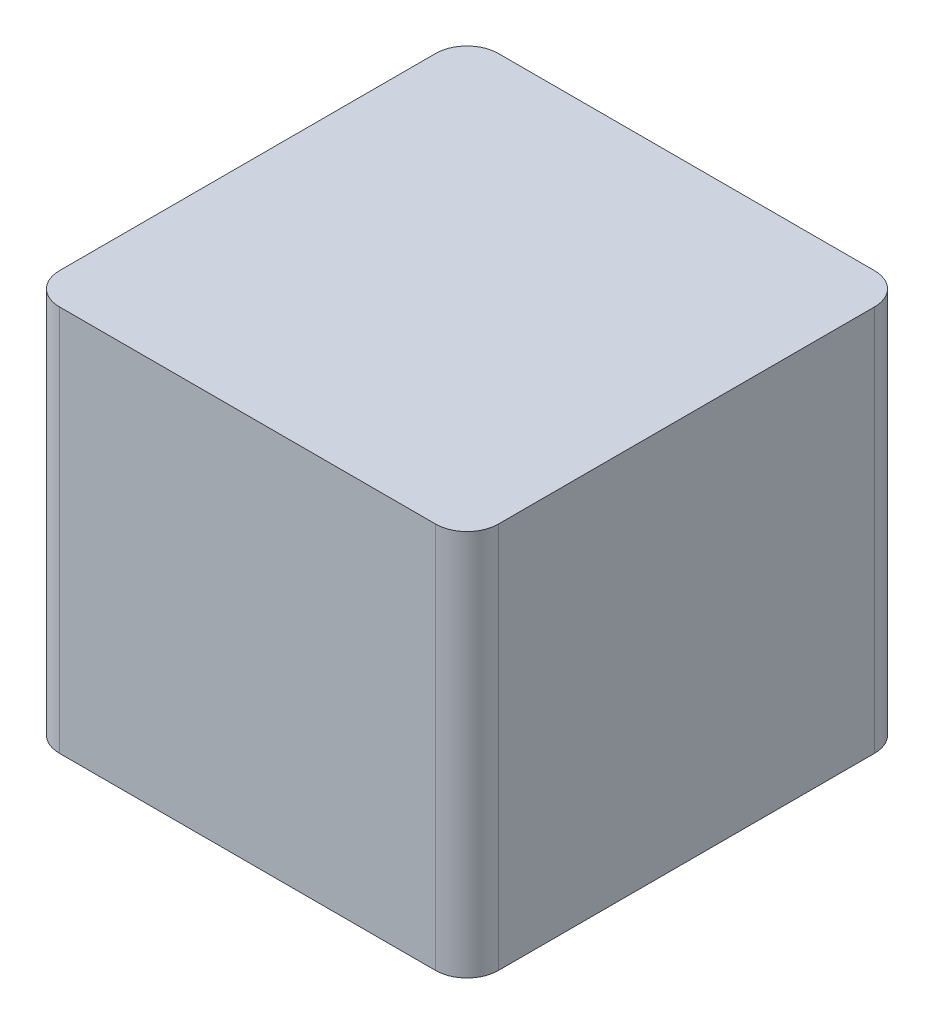
ISO-10303-21;
HEADER;
FILE_DESCRIPTION(('STEP AP214'),'2;1');
FILE_NAME('part.step','',(''),(''),'','','');
FILE_SCHEMA(('AUTOMOTIVE_DESIGN { 1 0 10303 214 1 1 1 1 }'));
ENDSEC;
DATA;
#1=APPLICATION_CONTEXT('core data for automotive mechanical design processes');
#2=APPLICATION_PROTOCOL_DEFINITION('international standard','automotive_design',2000,#1);
#3=PRODUCT_CONTEXT('',#1,'mechanical');
#4=PRODUCT('Part','Part','',(#3));
#5=PRODUCT_RELATED_PRODUCT_CATEGORY('part','',(#4));
#6=PRODUCT_DEFINITION_FORMATION('','',#4);
#7=PRODUCT_DEFINITION_CONTEXT('part definition',#1,'design');
#8=PRODUCT_DEFINITION('design','',#6,#7);
#9=PRODUCT_DEFINITION_SHAPE('','',#8);
#10=(LENGTH_UNIT() NAMED_UNIT(*) SI_UNIT(.MILLI.,.METRE.));
#11=(NAMED_UNIT(*) PLANE_ANGLE_UNIT() SI_UNIT($,.RADIAN.));
#12=(NAMED_UNIT(*) SI_UNIT($,.STERADIAN.) SOLID_ANGLE_UNIT());
#13=UNCERTAINTY_MEASURE_WITH_UNIT(LENGTH_MEASURE(1.E-05),#10,'distance_accuracy_value','');
#14=(GEOMETRIC_REPRESENTATION_CONTEXT(3) GLOBAL_UNCERTAINTY_ASSIGNED_CONTEXT((#13)) GLOBAL_UNIT_ASSIGNED_CONTEXT((#10,
#11,#12)) REPRESENTATION_CONTEXT('',''));
#15=CARTESIAN_POINT('',(0.,0.,0.));
#16=DIRECTION('',(0.,0.,1.));
#17=DIRECTION('',(1.,0.,0.));
#18=AXIS2_PLACEMENT_3D('',#15,#16,#17);
#19=CARTESIAN_POINT('',(0.,37.,42.));
#20=DIRECTION('',(1.,0.,0.));
#21=DIRECTION('',(0.,0.,-1.));
#22=AXIS2_PLACEMENT_3D('',#19,#20,#21);
#23=PLANE('',#22);
#24=DIRECTION('',(0.,0.,-1.));
#25=VECTOR('',#24,1.);
#26=CARTESIAN_POINT('',(0.,37.,42.));
#27=LINE('',#26,#25);
#28=CARTESIAN_POINT('',(0.,37.,39.));
#29=VERTEX_POINT('',#28);
#30=CARTESIAN_POINT('',(0.,37.,3.00000000000002));
#31=VERTEX_POINT('',#30);
#32=EDGE_CURVE('E160',#29,#31,#27,.T.);
#33=ORIENTED_EDGE('',*,*,#32,.T.);
#34=DIRECTION('',(0.,-1.,0.));
#35=VECTOR('',#34,1.);
#36=CARTESIAN_POINT('',(0.,37.,3.));
#37=LINE('',#36,#35);
#38=CARTESIAN_POINT('',(0.,0.,3.00000000000002));
#39=VERTEX_POINT('',#38);
#40=EDGE_CURVE('E124',#31,#39,#37,.T.);
#41=ORIENTED_EDGE('',*,*,#40,.T.);
#42=DIRECTION('',(0.,0.,-1.));
#43=VECTOR('',#42,1.);
#44=CARTESIAN_POINT('',(0.,0.,42.));
#45=LINE('',#44,#43);
#46=CARTESIAN_POINT('',(0.,0.,39.));
#47=VERTEX_POINT('',#46);
#48=EDGE_CURVE('E109',#47,#39,#45,.T.);
#49=ORIENTED_EDGE('',*,*,#48,.F.);
#50=DIRECTION('',(0.,-1.,0.));
#51=VECTOR('',#50,1.);
#52=CARTESIAN_POINT('',(0.,37.,39.));
#53=LINE('',#52,#51);
#54=EDGE_CURVE('E121',#47,#29,#53,.F.);
#55=ORIENTED_EDGE('',*,*,#54,.T.);
#56=EDGE_LOOP('',(#33,#41,#49,#55));
#57=FACE_BOUND('',#56,.T.);
#58=ADVANCED_FACE('F39',(#57),#23,.F.);
#59=CARTESIAN_POINT('',(0.,0.,42.));
#60=DIRECTION('',(0.,1.,0.));
#61=DIRECTION('',(0.,0.,1.));
#62=AXIS2_PLACEMENT_3D('',#59,#60,#61);
#63=PLANE('',#62);
#64=ORIENTED_EDGE('',*,*,#48,.T.);
#65=CARTESIAN_POINT('',(3.,0.,3.));
#66=DIRECTION('',(0.,1.,0.));
#67=DIRECTION('',(0.,0.,1.));
#68=AXIS2_PLACEMENT_3D('',#65,#66,#67);
#69=CIRCLE('',#68,3.);
#70=CARTESIAN_POINT('',(3.,0.,0.));
#71=VERTEX_POINT('',#70);
#72=EDGE_CURVE('E136',#39,#71,#69,.F.);
#73=ORIENTED_EDGE('',*,*,#72,.T.);
#74=DIRECTION('',(1.,0.,0.));
#75=VECTOR('',#74,1.);
#76=CARTESIAN_POINT('',(0.,0.,0.));
#77=LINE('',#76,#75);
#78=CARTESIAN_POINT('',(39.,0.,0.));
#79=VERTEX_POINT('',#78);
#80=EDGE_CURVE('E167',#71,#79,#77,.T.);
#81=ORIENTED_EDGE('',*,*,#80,.T.);
#82=CARTESIAN_POINT('',(39.,0.,3.));
#83=DIRECTION('',(0.,1.,0.));
#84=DIRECTION('',(0.,0.,1.));
#85=AXIS2_PLACEMENT_3D('',#82,#83,#84);
#86=CIRCLE('',#85,3.);
#87=CARTESIAN_POINT('',(42.,0.,3.00000000000002));
#88=VERTEX_POINT('',#87);
#89=EDGE_CURVE('E115',#79,#88,#86,.F.);
#90=ORIENTED_EDGE('',*,*,#89,.T.);
#91=DIRECTION('',(0.,0.,-1.));
#92=VECTOR('',#91,1.);
#93=CARTESIAN_POINT('',(42.,0.,42.));
#94=LINE('',#93,#92);
#95=CARTESIAN_POINT('',(42.,0.,39.));
#96=VERTEX_POINT('',#95);
#97=EDGE_CURVE('E125',#96,#88,#94,.T.);
#98=ORIENTED_EDGE('',*,*,#97,.F.);
#99=CARTESIAN_POINT('',(39.,0.,39.));
#100=DIRECTION('',(0.,1.,0.));
#101=DIRECTION('',(0.,0.,1.));
#102=AXIS2_PLACEMENT_3D('',#99,#100,#101);
#103=CIRCLE('',#102,3.);
#104=CARTESIAN_POINT('',(39.,0.,42.));
#105=VERTEX_POINT('',#104);
#106=EDGE_CURVE('E116',#96,#105,#103,.F.);
#107=ORIENTED_EDGE('',*,*,#106,.T.);
#108=DIRECTION('',(1.,0.,0.));
#109=VECTOR('',#108,1.);
#110=CARTESIAN_POINT('',(0.,0.,42.));
#111=LINE('',#110,#109);
#112=CARTESIAN_POINT('',(3.,0.,42.));
#113=VERTEX_POINT('',#112);
#114=EDGE_CURVE('E111',#113,#105,#111,.T.);
#115=ORIENTED_EDGE('',*,*,#114,.F.);
#116=CARTESIAN_POINT('',(3.,0.,39.));
#117=DIRECTION('',(0.,1.,0.));
#118=DIRECTION('',(0.,0.,1.));
#119=AXIS2_PLACEMENT_3D('',#116,#117,#118);
#120=CIRCLE('',#119,3.);
#121=EDGE_CURVE('E106',#113,#47,#120,.F.);
#122=ORIENTED_EDGE('',*,*,#121,.T.);
#123=EDGE_LOOP('',(#64,#73,#81,#90,#98,#107,#115,#122));
#124=FACE_BOUND('',#123,.T.);
#125=ADVANCED_FACE('F108',(#124),#63,.F.);
#126=CARTESIAN_POINT('',(42.,0.,42.));
#127=DIRECTION('',(-1.,0.,0.));
#128=DIRECTION('',(0.,0.,1.));
#129=AXIS2_PLACEMENT_3D('',#126,#127,#128);
#130=PLANE('',#129);
#131=ORIENTED_EDGE('',*,*,#97,.T.);
#132=DIRECTION('',(0.,1.,0.));
#133=VECTOR('',#132,1.);
#134=CARTESIAN_POINT('',(42.,0.,3.));
#135=LINE('',#134,#133);
#136=CARTESIAN_POINT('',(42.,37.,3.00000000000002));
#137=VERTEX_POINT('',#136);
#138=EDGE_CURVE('E149',#88,#137,#135,.T.);
#139=ORIENTED_EDGE('',*,*,#138,.T.);
#140=DIRECTION('',(0.,0.,-1.));
#141=VECTOR('',#140,1.);
#142=CARTESIAN_POINT('',(42.,37.,42.));
#143=LINE('',#142,#141);
#144=CARTESIAN_POINT('',(42.,37.,39.));
#145=VERTEX_POINT('',#144);
#146=EDGE_CURVE('E162',#145,#137,#143,.T.);
#147=ORIENTED_EDGE('',*,*,#146,.F.);
#148=DIRECTION('',(0.,1.,0.));
#149=VECTOR('',#148,1.);
#150=CARTESIAN_POINT('',(42.,0.,39.));
#151=LINE('',#150,#149);
#152=EDGE_CURVE('E147',#145,#96,#151,.F.);
#153=ORIENTED_EDGE('',*,*,#152,.T.);
#154=EDGE_LOOP('',(#131,#139,#147,#153));
#155=FACE_BOUND('',#154,.T.);
#156=ADVANCED_FACE('F174',(#155),#130,.F.);
#157=CARTESIAN_POINT('',(42.,37.,42.));
#158=DIRECTION('',(0.,-1.,0.));
#159=DIRECTION('',(0.,0.,-1.));
#160=AXIS2_PLACEMENT_3D('',#157,#158,#159);
#161=PLANE('',#160);
#162=DIRECTION('',(-1.,0.,0.));
#163=VECTOR('',#162,1.);
#164=CARTESIAN_POINT('',(42.,37.,0.));
#165=LINE('',#164,#163);
#166=CARTESIAN_POINT('',(39.,37.,0.));
#167=VERTEX_POINT('',#166);
#168=CARTESIAN_POINT('',(3.00000000000002,37.,0.));
#169=VERTEX_POINT('',#168);
#170=EDGE_CURVE('E164',#167,#169,#165,.T.);
#171=ORIENTED_EDGE('',*,*,#170,.T.);
#172=CARTESIAN_POINT('',(3.,37.,3.));
#173=DIRECTION('',(0.,-1.,0.));
#174=DIRECTION('',(0.,0.,-1.));
#175=AXIS2_PLACEMENT_3D('',#172,#173,#174);
#176=CIRCLE('',#175,3.);
#177=EDGE_CURVE('E145',#169,#31,#176,.F.);
#178=ORIENTED_EDGE('',*,*,#177,.T.);
#179=ORIENTED_EDGE('',*,*,#32,.F.);
#180=CARTESIAN_POINT('',(3.,37.,39.));
#181=DIRECTION('',(0.,-1.,0.));
#182=DIRECTION('',(0.,0.,-1.));
#183=AXIS2_PLACEMENT_3D('',#180,#181,#182);
#184=CIRCLE('',#183,3.);
#185=CARTESIAN_POINT('',(3.00000000000002,37.,42.));
#186=VERTEX_POINT('',#185);
#187=EDGE_CURVE('E129',#29,#186,#184,.F.);
#188=ORIENTED_EDGE('',*,*,#187,.T.);
#189=DIRECTION('',(-1.,0.,0.));
#190=VECTOR('',#189,1.);
#191=CARTESIAN_POINT('',(42.,37.,42.));
#192=LINE('',#191,#190);
#193=CARTESIAN_POINT('',(39.,37.,42.));
#194=VERTEX_POINT('',#193);
#195=EDGE_CURVE('E155',#194,#186,#192,.T.);
#196=ORIENTED_EDGE('',*,*,#195,.F.);
#197=CARTESIAN_POINT('',(39.,37.,39.));
#198=DIRECTION('',(0.,-1.,0.));
#199=DIRECTION('',(0.,0.,-1.));
#200=AXIS2_PLACEMENT_3D('',#197,#198,#199);
#201=CIRCLE('',#200,3.);
#202=EDGE_CURVE('E62',#194,#145,#201,.F.);
#203=ORIENTED_EDGE('',*,*,#202,.T.);
#204=ORIENTED_EDGE('',*,*,#146,.T.);
#205=CARTESIAN_POINT('',(39.,37.,3.));
#206=DIRECTION('',(0.,-1.,0.));
#207=DIRECTION('',(0.,0.,-1.));
#208=AXIS2_PLACEMENT_3D('',#205,#206,#207);
#209=CIRCLE('',#208,3.);
#210=EDGE_CURVE('E54',#137,#167,#209,.F.);
#211=ORIENTED_EDGE('',*,*,#210,.T.);
#212=EDGE_LOOP('',(#171,#178,#179,#188,#196,#203,#204,#211));
#213=FACE_BOUND('',#212,.T.);
#214=ADVANCED_FACE('F159',(#213),#161,.F.);
#215=CARTESIAN_POINT('',(0.,0.,42.));
#216=DIRECTION('',(0.,0.,1.));
#217=DIRECTION('',(1.,0.,0.));
#218=AXIS2_PLACEMENT_3D('',#215,#216,#217);
#219=PLANE('',#218);
#220=ORIENTED_EDGE('',*,*,#195,.T.);
#221=DIRECTION('',(0.,-1.,0.));
#222=VECTOR('',#221,1.);
#223=CARTESIAN_POINT('',(3.,0.,42.));
#224=LINE('',#223,#222);
#225=EDGE_CURVE('E11',#186,#113,#224,.T.);
#226=ORIENTED_EDGE('',*,*,#225,.T.);
#227=ORIENTED_EDGE('',*,*,#114,.T.);
#228=DIRECTION('',(0.,1.,0.));
#229=VECTOR('',#228,1.);
#230=CARTESIAN_POINT('',(39.,37.,42.));
#231=LINE('',#230,#229);
#232=EDGE_CURVE('E47',#105,#194,#231,.T.);
#233=ORIENTED_EDGE('',*,*,#232,.T.);
#234=EDGE_LOOP('',(#220,#226,#227,#233));
#235=FACE_BOUND('',#234,.T.);
#236=ADVANCED_FACE('F154',(#235),#219,.T.);
#237=CARTESIAN_POINT('',(0.,0.,0.));
#238=DIRECTION('',(0.,0.,1.));
#239=DIRECTION('',(1.,0.,0.));
#240=AXIS2_PLACEMENT_3D('',#237,#238,#239);
#241=PLANE('',#240);
#242=ORIENTED_EDGE('',*,*,#80,.F.);
#243=DIRECTION('',(0.,-1.,0.));
#244=VECTOR('',#243,1.);
#245=CARTESIAN_POINT('',(3.,0.,0.));
#246=LINE('',#245,#244);
#247=EDGE_CURVE('E140',#71,#169,#246,.F.);
#248=ORIENTED_EDGE('',*,*,#247,.T.);
#249=ORIENTED_EDGE('',*,*,#170,.F.);
#250=DIRECTION('',(0.,1.,0.));
#251=VECTOR('',#250,1.);
#252=CARTESIAN_POINT('',(39.,0.,0.));
#253=LINE('',#252,#251);
#254=EDGE_CURVE('E138',#167,#79,#253,.F.);
#255=ORIENTED_EDGE('',*,*,#254,.T.);
#256=EDGE_LOOP('',(#242,#248,#249,#255));
#257=FACE_BOUND('',#256,.T.);
#258=ADVANCED_FACE('F181',(#257),#241,.F.);
#259=CARTESIAN_POINT('',(3.,37.,3.));
#260=DIRECTION('',(0.,-1.,0.));
#261=DIRECTION('',(0.,0.,-1.));
#262=AXIS2_PLACEMENT_3D('',#259,#260,#261);
#263=CYLINDRICAL_SURFACE('',#262,3.);
#264=ORIENTED_EDGE('',*,*,#177,.F.);
#265=ORIENTED_EDGE('',*,*,#247,.F.);
#266=ORIENTED_EDGE('',*,*,#72,.F.);
#267=ORIENTED_EDGE('',*,*,#40,.F.);
#268=EDGE_LOOP('',(#264,#265,#266,#267));
#269=FACE_BOUND('',#268,.T.);
#270=ADVANCED_FACE('F185',(#269),#263,.T.);
#271=CARTESIAN_POINT('',(39.,0.,3.));
#272=DIRECTION('',(0.,1.,0.));
#273=DIRECTION('',(0.,0.,1.));
#274=AXIS2_PLACEMENT_3D('',#271,#272,#273);
#275=CYLINDRICAL_SURFACE('',#274,3.);
#276=ORIENTED_EDGE('',*,*,#89,.F.);
#277=ORIENTED_EDGE('',*,*,#254,.F.);
#278=ORIENTED_EDGE('',*,*,#210,.F.);
#279=ORIENTED_EDGE('',*,*,#138,.F.);
#280=EDGE_LOOP('',(#276,#277,#278,#279));
#281=FACE_BOUND('',#280,.T.);
#282=ADVANCED_FACE('F177',(#281),#275,.T.);
#283=CARTESIAN_POINT('',(3.,0.,39.));
#284=DIRECTION('',(0.,1.,0.));
#285=DIRECTION('',(0.,0.,1.));
#286=AXIS2_PLACEMENT_3D('',#283,#284,#285);
#287=CYLINDRICAL_SURFACE('',#286,3.);
#288=ORIENTED_EDGE('',*,*,#187,.F.);
#289=ORIENTED_EDGE('',*,*,#54,.F.);
#290=ORIENTED_EDGE('',*,*,#121,.F.);
#291=ORIENTED_EDGE('',*,*,#225,.F.);
#292=EDGE_LOOP('',(#288,#289,#290,#291));
#293=FACE_BOUND('',#292,.T.);
#294=ADVANCED_FACE('F128',(#293),#287,.T.);
#295=CARTESIAN_POINT('',(39.,0.,39.));
#296=DIRECTION('',(0.,-1.,0.));
#297=DIRECTION('',(0.,0.,-1.));
#298=AXIS2_PLACEMENT_3D('',#295,#296,#297);
#299=CYLINDRICAL_SURFACE('',#298,3.);
#300=ORIENTED_EDGE('',*,*,#106,.F.);
#301=ORIENTED_EDGE('',*,*,#152,.F.);
#302=ORIENTED_EDGE('',*,*,#202,.F.);
#303=ORIENTED_EDGE('',*,*,#232,.F.);
#304=EDGE_LOOP('',(#300,#301,#302,#303));
#305=FACE_BOUND('',#304,.T.);
#306=ADVANCED_FACE('F41',(#305),#299,.T.);
#307=CLOSED_SHELL('',(#58,#125,#156,#214,#236,#258,#270,#282,#294,#306));
#308=MANIFOLD_SOLID_BREP('B2',#307);
#309=ADVANCED_BREP_SHAPE_REPRESENTATION('',(#18,#308),#14);
#310=SHAPE_DEFINITION_REPRESENTATION(#9,#309);
ENDSEC;
END-ISO-10303-21;
